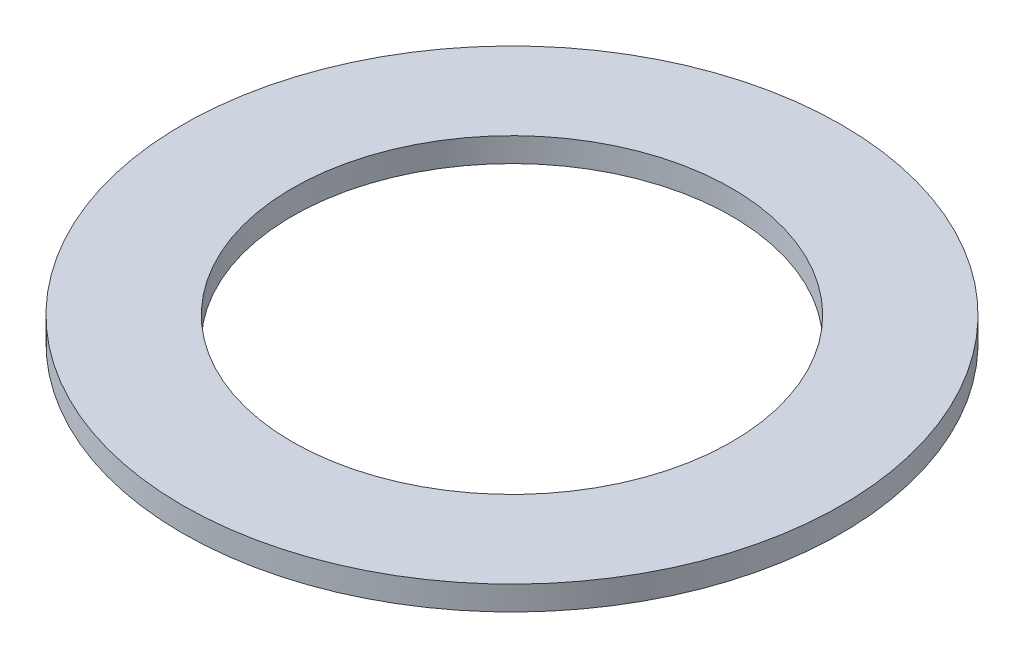
ISO-10303-21;
HEADER;
FILE_DESCRIPTION(('STEP AP214'),'2;1');
FILE_NAME('part.step','',(''),(''),'','','');
FILE_SCHEMA(('AUTOMOTIVE_DESIGN { 1 0 10303 214 1 1 1 1 }'));
ENDSEC;
DATA;
#1=APPLICATION_CONTEXT('core data for automotive mechanical design processes');
#2=APPLICATION_PROTOCOL_DEFINITION('international standard','automotive_design',2000,#1);
#3=PRODUCT_CONTEXT('',#1,'mechanical');
#4=PRODUCT('Part','Part','',(#3));
#5=PRODUCT_RELATED_PRODUCT_CATEGORY('part','',(#4));
#6=PRODUCT_DEFINITION_FORMATION('','',#4);
#7=PRODUCT_DEFINITION_CONTEXT('part definition',#1,'design');
#8=PRODUCT_DEFINITION('design','',#6,#7);
#9=PRODUCT_DEFINITION_SHAPE('','',#8);
#10=(LENGTH_UNIT() NAMED_UNIT(*) SI_UNIT(.MILLI.,.METRE.));
#11=(NAMED_UNIT(*) PLANE_ANGLE_UNIT() SI_UNIT($,.RADIAN.));
#12=(NAMED_UNIT(*) SI_UNIT($,.STERADIAN.) SOLID_ANGLE_UNIT());
#13=UNCERTAINTY_MEASURE_WITH_UNIT(LENGTH_MEASURE(1.E-05),#10,'distance_accuracy_value','');
#14=(GEOMETRIC_REPRESENTATION_CONTEXT(3) GLOBAL_UNCERTAINTY_ASSIGNED_CONTEXT((#13)) GLOBAL_UNIT_ASSIGNED_CONTEXT((#10,
#11,#12)) REPRESENTATION_CONTEXT('',''));
#15=CARTESIAN_POINT('',(0.,0.,0.));
#16=DIRECTION('',(0.,0.,1.));
#17=DIRECTION('',(1.,0.,0.));
#18=AXIS2_PLACEMENT_3D('',#15,#16,#17);
#19=CARTESIAN_POINT('',(0.,5.5,0.));
#20=DIRECTION('',(0.,1.,0.));
#21=DIRECTION('',(0.,0.,1.));
#22=AXIS2_PLACEMENT_3D('',#19,#20,#21);
#23=PLANE('',#22);
#24=CARTESIAN_POINT('',(0.,5.5,0.));
#25=DIRECTION('',(0.,1.,0.));
#26=DIRECTION('',(0.,0.,1.));
#27=AXIS2_PLACEMENT_3D('',#24,#25,#26);
#28=CIRCLE('',#27,75.);
#29=CARTESIAN_POINT('',(0.,5.5,75.));
#30=VERTEX_POINT('',#29);
#31=EDGE_CURVE('E10',#30,#30,#28,.T.);
#32=ORIENTED_EDGE('',*,*,#31,.T.);
#33=EDGE_LOOP('',(#32));
#34=FACE_BOUND('',#33,.T.);
#35=CARTESIAN_POINT('',(0.,5.5,0.));
#36=DIRECTION('',(0.,1.,0.));
#37=DIRECTION('',(0.,0.,1.));
#38=AXIS2_PLACEMENT_3D('',#35,#36,#37);
#39=CIRCLE('',#38,50.);
#40=CARTESIAN_POINT('',(0.,5.5,50.));
#41=VERTEX_POINT('',#40);
#42=EDGE_CURVE('E54',#41,#41,#39,.T.);
#43=ORIENTED_EDGE('',*,*,#42,.F.);
#44=EDGE_LOOP('',(#43));
#45=FACE_BOUND('',#44,.T.);
#46=ADVANCED_FACE('F41',(#34,#45),#23,.T.);
#47=CARTESIAN_POINT('',(0.,0.,0.));
#48=DIRECTION('',(0.,1.,0.));
#49=DIRECTION('',(0.,0.,1.));
#50=AXIS2_PLACEMENT_3D('',#47,#48,#49);
#51=PLANE('',#50);
#52=CARTESIAN_POINT('',(0.,0.,0.));
#53=DIRECTION('',(0.,1.,0.));
#54=DIRECTION('',(0.,0.,1.));
#55=AXIS2_PLACEMENT_3D('',#52,#53,#54);
#56=CIRCLE('',#55,75.);
#57=CARTESIAN_POINT('',(0.,0.,75.));
#58=VERTEX_POINT('',#57);
#59=EDGE_CURVE('E45',#58,#58,#56,.T.);
#60=ORIENTED_EDGE('',*,*,#59,.F.);
#61=EDGE_LOOP('',(#60));
#62=FACE_BOUND('',#61,.T.);
#63=CARTESIAN_POINT('',(0.,0.,0.));
#64=DIRECTION('',(0.,1.,0.));
#65=DIRECTION('',(0.,0.,1.));
#66=AXIS2_PLACEMENT_3D('',#63,#64,#65);
#67=CIRCLE('',#66,50.);
#68=CARTESIAN_POINT('',(0.,0.,50.));
#69=VERTEX_POINT('',#68);
#70=EDGE_CURVE('E56',#69,#69,#67,.T.);
#71=ORIENTED_EDGE('',*,*,#70,.T.);
#72=EDGE_LOOP('',(#71));
#73=FACE_BOUND('',#72,.T.);
#74=ADVANCED_FACE('F68',(#62,#73),#51,.F.);
#75=CARTESIAN_POINT('',(0.,5.5,0.));
#76=DIRECTION('',(0.,-1.,0.));
#77=DIRECTION('',(0.,0.,-1.));
#78=AXIS2_PLACEMENT_3D('',#75,#76,#77);
#79=CYLINDRICAL_SURFACE('',#78,75.);
#80=ORIENTED_EDGE('',*,*,#31,.F.);
#81=EDGE_LOOP('',(#80));
#82=FACE_BOUND('',#81,.T.);
#83=ORIENTED_EDGE('',*,*,#59,.T.);
#84=EDGE_LOOP('',(#83));
#85=FACE_BOUND('',#84,.T.);
#86=ADVANCED_FACE('F43',(#82,#85),#79,.T.);
#87=CARTESIAN_POINT('',(0.,5.5,0.));
#88=DIRECTION('',(0.,-1.,0.));
#89=DIRECTION('',(0.,0.,-1.));
#90=AXIS2_PLACEMENT_3D('',#87,#88,#89);
#91=CYLINDRICAL_SURFACE('',#90,50.);
#92=ORIENTED_EDGE('',*,*,#42,.T.);
#93=EDGE_LOOP('',(#92));
#94=FACE_BOUND('',#93,.T.);
#95=ORIENTED_EDGE('',*,*,#70,.F.);
#96=EDGE_LOOP('',(#95));
#97=FACE_BOUND('',#96,.T.);
#98=ADVANCED_FACE('F64',(#94,#97),#91,.F.);
#99=CLOSED_SHELL('',(#46,#74,#86,#98));
#100=MANIFOLD_SOLID_BREP('B2',#99);
#101=ADVANCED_BREP_SHAPE_REPRESENTATION('',(#18,#100),#14);
#102=SHAPE_DEFINITION_REPRESENTATION(#9,#101);
ENDSEC;
END-ISO-10303-21;
